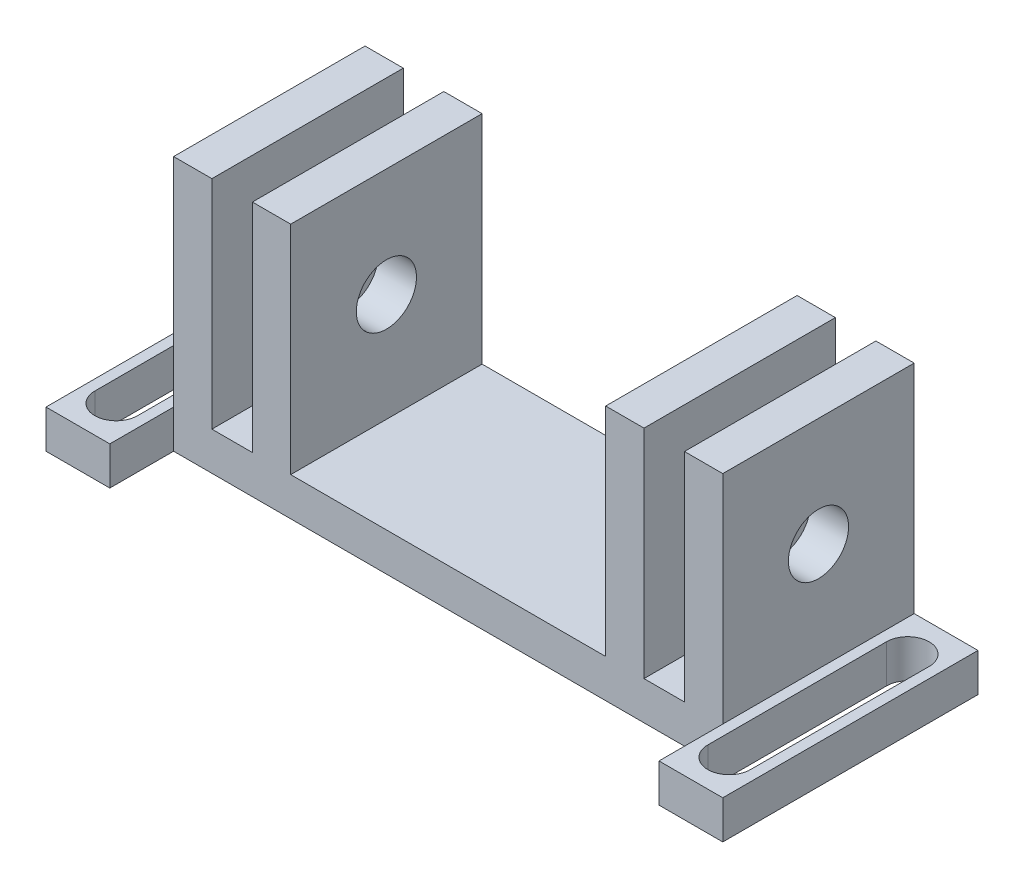
ISO-10303-21;
HEADER;
FILE_DESCRIPTION(('STEP AP214'),'2;1');
FILE_NAME('part.step','',(''),(''),'','','');
FILE_SCHEMA(('AUTOMOTIVE_DESIGN { 1 0 10303 214 1 1 1 1 }'));
ENDSEC;
DATA;
#1=APPLICATION_CONTEXT('core data for automotive mechanical design processes');
#2=APPLICATION_PROTOCOL_DEFINITION('international standard','automotive_design',2000,#1);
#3=PRODUCT_CONTEXT('',#1,'mechanical');
#4=PRODUCT('Part','Part','',(#3));
#5=PRODUCT_RELATED_PRODUCT_CATEGORY('part','',(#4));
#6=PRODUCT_DEFINITION_FORMATION('','',#4);
#7=PRODUCT_DEFINITION_CONTEXT('part definition',#1,'design');
#8=PRODUCT_DEFINITION('design','',#6,#7);
#9=PRODUCT_DEFINITION_SHAPE('','',#8);
#10=(LENGTH_UNIT() NAMED_UNIT(*) SI_UNIT(.MILLI.,.METRE.));
#11=(NAMED_UNIT(*) PLANE_ANGLE_UNIT() SI_UNIT($,.RADIAN.));
#12=(NAMED_UNIT(*) SI_UNIT($,.STERADIAN.) SOLID_ANGLE_UNIT());
#13=UNCERTAINTY_MEASURE_WITH_UNIT(LENGTH_MEASURE(1.E-05),#10,'distance_accuracy_value','');
#14=(GEOMETRIC_REPRESENTATION_CONTEXT(3) GLOBAL_UNCERTAINTY_ASSIGNED_CONTEXT((#13)) GLOBAL_UNIT_ASSIGNED_CONTEXT((#10,
#11,#12)) REPRESENTATION_CONTEXT('',''));
#15=CARTESIAN_POINT('',(0.,0.,0.));
#16=DIRECTION('',(0.,0.,1.));
#17=DIRECTION('',(1.,0.,0.));
#18=AXIS2_PLACEMENT_3D('',#15,#16,#17);
#19=CARTESIAN_POINT('',(21.5173,0.,-28.4315700557794));
#20=DIRECTION('',(1.,0.,0.));
#21=DIRECTION('',(0.,0.,-1.));
#22=AXIS2_PLACEMENT_3D('',#19,#20,#21);
#23=PLANE('',#22);
#24=CARTESIAN_POINT('',(21.5173,11.4772452641454,0.));
#25=DIRECTION('',(-1.,0.,0.));
#26=DIRECTION('',(0.,0.,1.));
#27=AXIS2_PLACEMENT_3D('',#24,#25,#26);
#28=CIRCLE('',#27,2.35818884896752);
#29=CARTESIAN_POINT('',(21.5173,11.4772452641454,2.35818884896752));
#30=VERTEX_POINT('',#29);
#31=EDGE_CURVE('E374',#30,#30,#28,.T.);
#32=ORIENTED_EDGE('',*,*,#31,.T.);
#33=EDGE_LOOP('',(#32));
#34=FACE_BOUND('',#33,.T.);
#35=DIRECTION('',(0.,1.,0.));
#36=VECTOR('',#35,1.);
#37=CARTESIAN_POINT('',(21.5173,0.,7.5));
#38=LINE('',#37,#36);
#39=CARTESIAN_POINT('',(21.5173,3.,7.5));
#40=VERTEX_POINT('',#39);
#41=CARTESIAN_POINT('',(21.5173,20.,7.5));
#42=VERTEX_POINT('',#41);
#43=EDGE_CURVE('E420',#40,#42,#38,.T.);
#44=ORIENTED_EDGE('',*,*,#43,.F.);
#45=DIRECTION('',(0.,0.,-1.));
#46=VECTOR('',#45,1.);
#47=CARTESIAN_POINT('',(21.5173,3.,-7.5));
#48=LINE('',#47,#46);
#49=CARTESIAN_POINT('',(21.5173,3.,-7.5));
#50=VERTEX_POINT('',#49);
#51=EDGE_CURVE('E11',#40,#50,#48,.T.);
#52=ORIENTED_EDGE('',*,*,#51,.T.);
#53=DIRECTION('',(0.,1.,0.));
#54=VECTOR('',#53,1.);
#55=CARTESIAN_POINT('',(21.5173,0.,-7.5));
#56=LINE('',#55,#54);
#57=CARTESIAN_POINT('',(21.5173,20.,-7.5));
#58=VERTEX_POINT('',#57);
#59=EDGE_CURVE('E419',#50,#58,#56,.T.);
#60=ORIENTED_EDGE('',*,*,#59,.T.);
#61=DIRECTION('',(0.,0.,1.));
#62=VECTOR('',#61,1.);
#63=CARTESIAN_POINT('',(21.5173,20.,-28.4315700557794));
#64=LINE('',#63,#62);
#65=EDGE_CURVE('E423',#58,#42,#64,.T.);
#66=ORIENTED_EDGE('',*,*,#65,.T.);
#67=EDGE_LOOP('',(#44,#52,#60,#66));
#68=FACE_BOUND('',#67,.T.);
#69=ADVANCED_FACE('F45',(#34,#68),#23,.T.);
#70=CARTESIAN_POINT('',(15.3423,3.,7.5));
#71=DIRECTION('',(-1.,0.,0.));
#72=DIRECTION('',(0.,0.,1.));
#73=AXIS2_PLACEMENT_3D('',#70,#71,#72);
#74=PLANE('',#73);
#75=CARTESIAN_POINT('',(15.3423,11.4772452641454,0.));
#76=DIRECTION('',(-1.,0.,0.));
#77=DIRECTION('',(0.,0.,1.));
#78=AXIS2_PLACEMENT_3D('',#75,#76,#77);
#79=CIRCLE('',#78,2.35818884896752);
#80=CARTESIAN_POINT('',(15.3423,11.4772452641454,2.35818884896752));
#81=VERTEX_POINT('',#80);
#82=EDGE_CURVE('E394',#81,#81,#79,.T.);
#83=ORIENTED_EDGE('',*,*,#82,.T.);
#84=EDGE_LOOP('',(#83));
#85=FACE_BOUND('',#84,.T.);
#86=DIRECTION('',(0.,0.,1.));
#87=VECTOR('',#86,1.);
#88=CARTESIAN_POINT('',(15.3423,3.,-28.4315700557794));
#89=LINE('',#88,#87);
#90=CARTESIAN_POINT('',(15.3423,3.,-7.5));
#91=VERTEX_POINT('',#90);
#92=CARTESIAN_POINT('',(15.3423,3.,7.5));
#93=VERTEX_POINT('',#92);
#94=EDGE_CURVE('E404',#91,#93,#89,.T.);
#95=ORIENTED_EDGE('',*,*,#94,.F.);
#96=DIRECTION('',(0.,-1.,0.));
#97=VECTOR('',#96,1.);
#98=CARTESIAN_POINT('',(15.3423,3.,-7.5));
#99=LINE('',#98,#97);
#100=CARTESIAN_POINT('',(15.3423,20.,-7.5));
#101=VERTEX_POINT('',#100);
#102=EDGE_CURVE('E547',#101,#91,#99,.T.);
#103=ORIENTED_EDGE('',*,*,#102,.F.);
#104=DIRECTION('',(0.,0.,-1.));
#105=VECTOR('',#104,1.);
#106=CARTESIAN_POINT('',(15.3423,20.,-7.5));
#107=LINE('',#106,#105);
#108=CARTESIAN_POINT('',(15.3423,20.,7.5));
#109=VERTEX_POINT('',#108);
#110=EDGE_CURVE('E500',#109,#101,#107,.T.);
#111=ORIENTED_EDGE('',*,*,#110,.F.);
#112=DIRECTION('',(0.,-1.,0.));
#113=VECTOR('',#112,1.);
#114=CARTESIAN_POINT('',(15.3423,3.,7.5));
#115=LINE('',#114,#113);
#116=EDGE_CURVE('E560',#109,#93,#115,.T.);
#117=ORIENTED_EDGE('',*,*,#116,.T.);
#118=EDGE_LOOP('',(#95,#103,#111,#117));
#119=FACE_BOUND('',#118,.T.);
#120=ADVANCED_FACE('F651',(#85,#119),#74,.F.);
#121=CARTESIAN_POINT('',(-15.3423,3.,7.5));
#122=DIRECTION('',(-1.,0.,0.));
#123=DIRECTION('',(0.,0.,1.));
#124=AXIS2_PLACEMENT_3D('',#121,#122,#123);
#125=PLANE('',#124);
#126=CARTESIAN_POINT('',(-15.3423,11.4772452641454,0.));
#127=DIRECTION('',(-1.,0.,0.));
#128=DIRECTION('',(0.,0.,1.));
#129=AXIS2_PLACEMENT_3D('',#126,#127,#128);
#130=CIRCLE('',#129,2.35818884896752);
#131=CARTESIAN_POINT('',(-15.3423,11.4772452641454,2.35818884896752));
#132=VERTEX_POINT('',#131);
#133=EDGE_CURVE('E390',#132,#132,#130,.T.);
#134=ORIENTED_EDGE('',*,*,#133,.F.);
#135=EDGE_LOOP('',(#134));
#136=FACE_BOUND('',#135,.T.);
#137=DIRECTION('',(0.,-1.,0.));
#138=VECTOR('',#137,1.);
#139=CARTESIAN_POINT('',(-15.3423,3.,-7.5));
#140=LINE('',#139,#138);
#141=CARTESIAN_POINT('',(-15.3423,20.,-7.5));
#142=VERTEX_POINT('',#141);
#143=CARTESIAN_POINT('',(-15.3423,3.,-7.5));
#144=VERTEX_POINT('',#143);
#145=EDGE_CURVE('E55',#142,#144,#140,.T.);
#146=ORIENTED_EDGE('',*,*,#145,.T.);
#147=DIRECTION('',(0.,0.,1.));
#148=VECTOR('',#147,1.);
#149=CARTESIAN_POINT('',(-15.3423,3.,-28.4315700557794));
#150=LINE('',#149,#148);
#151=CARTESIAN_POINT('',(-15.3423,3.,7.5));
#152=VERTEX_POINT('',#151);
#153=EDGE_CURVE('E458',#144,#152,#150,.T.);
#154=ORIENTED_EDGE('',*,*,#153,.T.);
#155=DIRECTION('',(0.,-1.,0.));
#156=VECTOR('',#155,1.);
#157=CARTESIAN_POINT('',(-15.3423,3.,7.5));
#158=LINE('',#157,#156);
#159=CARTESIAN_POINT('',(-15.3423,20.,7.5));
#160=VERTEX_POINT('',#159);
#161=EDGE_CURVE('E556',#160,#152,#158,.T.);
#162=ORIENTED_EDGE('',*,*,#161,.F.);
#163=DIRECTION('',(0.,0.,1.));
#164=VECTOR('',#163,1.);
#165=CARTESIAN_POINT('',(-15.3423,20.,-7.5));
#166=LINE('',#165,#164);
#167=EDGE_CURVE('E513',#142,#160,#166,.T.);
#168=ORIENTED_EDGE('',*,*,#167,.F.);
#169=EDGE_LOOP('',(#146,#154,#162,#168));
#170=FACE_BOUND('',#169,.T.);
#171=ADVANCED_FACE('F657',(#136,#170),#125,.T.);
#172=CARTESIAN_POINT('',(0.,3.,0.));
#173=DIRECTION('',(0.,1.,0.));
#174=DIRECTION('',(0.,0.,1.));
#175=AXIS2_PLACEMENT_3D('',#172,#173,#174);
#176=PLANE('',#175);
#177=DIRECTION('',(1.,0.,0.));
#178=VECTOR('',#177,1.);
#179=CARTESIAN_POINT('',(-15.3423,3.,7.5));
#180=LINE('',#179,#178);
#181=CARTESIAN_POINT('',(-12.3423,3.,7.5));
#182=VERTEX_POINT('',#181);
#183=CARTESIAN_POINT('',(12.3423,3.,7.5));
#184=VERTEX_POINT('',#183);
#185=EDGE_CURVE('E543',#182,#184,#180,.T.);
#186=ORIENTED_EDGE('',*,*,#185,.T.);
#187=DIRECTION('',(0.,0.,1.));
#188=VECTOR('',#187,1.);
#189=CARTESIAN_POINT('',(12.3423,3.,-7.5));
#190=LINE('',#189,#188);
#191=CARTESIAN_POINT('',(12.3423,3.,-7.5));
#192=VERTEX_POINT('',#191);
#193=EDGE_CURVE('E495',#192,#184,#190,.T.);
#194=ORIENTED_EDGE('',*,*,#193,.F.);
#195=DIRECTION('',(1.,0.,0.));
#196=VECTOR('',#195,1.);
#197=CARTESIAN_POINT('',(-15.3423,3.,-7.5));
#198=LINE('',#197,#196);
#199=CARTESIAN_POINT('',(-12.3423,3.,-7.5));
#200=VERTEX_POINT('',#199);
#201=EDGE_CURVE('E539',#200,#192,#198,.T.);
#202=ORIENTED_EDGE('',*,*,#201,.F.);
#203=DIRECTION('',(0.,0.,-1.));
#204=VECTOR('',#203,1.);
#205=CARTESIAN_POINT('',(-12.3423,3.,-7.5));
#206=LINE('',#205,#204);
#207=EDGE_CURVE('E499',#182,#200,#206,.T.);
#208=ORIENTED_EDGE('',*,*,#207,.F.);
#209=EDGE_LOOP('',(#186,#194,#202,#208));
#210=FACE_BOUND('',#209,.T.);
#211=ADVANCED_FACE('F688',(#210),#176,.T.);
#212=CARTESIAN_POINT('',(-15.3423,3.,-7.5));
#213=DIRECTION('',(0.,0.,-1.));
#214=DIRECTION('',(-1.,0.,0.));
#215=AXIS2_PLACEMENT_3D('',#212,#213,#214);
#216=PLANE('',#215);
#217=DIRECTION('',(1.,0.,0.));
#218=VECTOR('',#217,1.);
#219=CARTESIAN_POINT('',(-15.3423,0.,-7.5));
#220=LINE('',#219,#218);
#221=CARTESIAN_POINT('',(-26.5173,0.,-7.5));
#222=VERTEX_POINT('',#221);
#223=CARTESIAN_POINT('',(26.5173,0.,-7.5));
#224=VERTEX_POINT('',#223);
#225=EDGE_CURVE('E538',#222,#224,#220,.T.);
#226=ORIENTED_EDGE('',*,*,#225,.F.);
#227=DIRECTION('',(0.,-1.,0.));
#228=VECTOR('',#227,1.);
#229=CARTESIAN_POINT('',(-26.5173,3.,-7.5));
#230=LINE('',#229,#228);
#231=CARTESIAN_POINT('',(-26.5173,3.,-7.5));
#232=VERTEX_POINT('',#231);
#233=EDGE_CURVE('E360',#232,#222,#230,.T.);
#234=ORIENTED_EDGE('',*,*,#233,.F.);
#235=DIRECTION('',(1.,0.,0.));
#236=VECTOR('',#235,1.);
#237=CARTESIAN_POINT('',(-21.5173,3.,-7.5));
#238=LINE('',#237,#236);
#239=CARTESIAN_POINT('',(-21.5173,3.,-7.5));
#240=VERTEX_POINT('',#239);
#241=EDGE_CURVE('E345',#232,#240,#238,.T.);
#242=ORIENTED_EDGE('',*,*,#241,.T.);
#243=DIRECTION('',(0.,1.,0.));
#244=VECTOR('',#243,1.);
#245=CARTESIAN_POINT('',(-21.5173,0.,-7.5));
#246=LINE('',#245,#244);
#247=CARTESIAN_POINT('',(-21.5173,20.,-7.5));
#248=VERTEX_POINT('',#247);
#249=EDGE_CURVE('E447',#240,#248,#246,.T.);
#250=ORIENTED_EDGE('',*,*,#249,.T.);
#251=DIRECTION('',(-1.,0.,0.));
#252=VECTOR('',#251,1.);
#253=CARTESIAN_POINT('',(0.,20.,-7.5));
#254=LINE('',#253,#252);
#255=CARTESIAN_POINT('',(-18.5173,20.,-7.5));
#256=VERTEX_POINT('',#255);
#257=EDGE_CURVE('E462',#256,#248,#254,.T.);
#258=ORIENTED_EDGE('',*,*,#257,.F.);
#259=DIRECTION('',(0.,-1.,0.));
#260=VECTOR('',#259,1.);
#261=CARTESIAN_POINT('',(-18.5173,0.,-7.5));
#262=LINE('',#261,#260);
#263=CARTESIAN_POINT('',(-18.5173,3.,-7.5));
#264=VERTEX_POINT('',#263);
#265=EDGE_CURVE('E466',#256,#264,#262,.T.);
#266=ORIENTED_EDGE('',*,*,#265,.T.);
#267=DIRECTION('',(-1.,0.,0.));
#268=VECTOR('',#267,1.);
#269=CARTESIAN_POINT('',(0.,3.,-7.5));
#270=LINE('',#269,#268);
#271=EDGE_CURVE('E453',#144,#264,#270,.T.);
#272=ORIENTED_EDGE('',*,*,#271,.F.);
#273=ORIENTED_EDGE('',*,*,#145,.F.);
#274=DIRECTION('',(-1.,0.,0.));
#275=VECTOR('',#274,1.);
#276=CARTESIAN_POINT('',(-15.3423,20.,-7.5));
#277=LINE('',#276,#275);
#278=CARTESIAN_POINT('',(-12.3423,20.,-7.5));
#279=VERTEX_POINT('',#278);
#280=EDGE_CURVE('E523',#279,#142,#277,.T.);
#281=ORIENTED_EDGE('',*,*,#280,.F.);
#282=DIRECTION('',(0.,-1.,0.));
#283=VECTOR('',#282,1.);
#284=CARTESIAN_POINT('',(-12.3423,20.,-7.5));
#285=LINE('',#284,#283);
#286=EDGE_CURVE('E527',#279,#200,#285,.T.);
#287=ORIENTED_EDGE('',*,*,#286,.T.);
#288=ORIENTED_EDGE('',*,*,#201,.T.);
#289=DIRECTION('',(0.,-1.,0.));
#290=VECTOR('',#289,1.);
#291=CARTESIAN_POINT('',(12.3423,20.,-7.5));
#292=LINE('',#291,#290);
#293=CARTESIAN_POINT('',(12.3423,20.,-7.5));
#294=VERTEX_POINT('',#293);
#295=EDGE_CURVE('E470',#294,#192,#292,.T.);
#296=ORIENTED_EDGE('',*,*,#295,.F.);
#297=DIRECTION('',(-1.,0.,0.));
#298=VECTOR('',#297,1.);
#299=CARTESIAN_POINT('',(15.3423,20.,-7.5));
#300=LINE('',#299,#298);
#301=EDGE_CURVE('E507',#101,#294,#300,.T.);
#302=ORIENTED_EDGE('',*,*,#301,.F.);
#303=ORIENTED_EDGE('',*,*,#102,.T.);
#304=DIRECTION('',(1.,0.,0.));
#305=VECTOR('',#304,1.);
#306=CARTESIAN_POINT('',(0.,3.,-7.5));
#307=LINE('',#306,#305);
#308=CARTESIAN_POINT('',(18.5173,3.,-7.5));
#309=VERTEX_POINT('',#308);
#310=EDGE_CURVE('E398',#91,#309,#307,.T.);
#311=ORIENTED_EDGE('',*,*,#310,.T.);
#312=DIRECTION('',(0.,1.,0.));
#313=VECTOR('',#312,1.);
#314=CARTESIAN_POINT('',(18.5173,0.,-7.5));
#315=LINE('',#314,#313);
#316=CARTESIAN_POINT('',(18.5173,20.,-7.5));
#317=VERTEX_POINT('',#316);
#318=EDGE_CURVE('E426',#309,#317,#315,.T.);
#319=ORIENTED_EDGE('',*,*,#318,.T.);
#320=DIRECTION('',(1.,0.,0.));
#321=VECTOR('',#320,1.);
#322=CARTESIAN_POINT('',(0.,20.,-7.5));
#323=LINE('',#322,#321);
#324=EDGE_CURVE('E429',#317,#58,#323,.T.);
#325=ORIENTED_EDGE('',*,*,#324,.T.);
#326=ORIENTED_EDGE('',*,*,#59,.F.);
#327=DIRECTION('',(1.,0.,0.));
#328=VECTOR('',#327,1.);
#329=CARTESIAN_POINT('',(21.5173,3.,-7.5));
#330=LINE('',#329,#328);
#331=CARTESIAN_POINT('',(26.5173,3.,-7.5));
#332=VERTEX_POINT('',#331);
#333=EDGE_CURVE('E64',#50,#332,#330,.T.);
#334=ORIENTED_EDGE('',*,*,#333,.T.);
#335=DIRECTION('',(0.,-1.,0.));
#336=VECTOR('',#335,1.);
#337=CARTESIAN_POINT('',(26.5173,3.,-7.5));
#338=LINE('',#337,#336);
#339=EDGE_CURVE('E747',#332,#224,#338,.T.);
#340=ORIENTED_EDGE('',*,*,#339,.T.);
#341=EDGE_LOOP('',(#226,#234,#242,#250,#258,#266,#272,#273,#281,#287,#288,#296,#302,#303,#311,
#319,#325,#326,#334,#340));
#342=FACE_BOUND('',#341,.T.);
#343=ADVANCED_FACE('F47',(#342),#216,.T.);
#344=CARTESIAN_POINT('',(-15.3423,3.,7.5));
#345=DIRECTION('',(0.,0.,-1.));
#346=DIRECTION('',(-1.,0.,0.));
#347=AXIS2_PLACEMENT_3D('',#344,#345,#346);
#348=PLANE('',#347);
#349=DIRECTION('',(1.,0.,0.));
#350=VECTOR('',#349,1.);
#351=CARTESIAN_POINT('',(-15.3423,0.,7.5));
#352=LINE('',#351,#350);
#353=CARTESIAN_POINT('',(-21.5173,0.,7.5));
#354=VERTEX_POINT('',#353);
#355=CARTESIAN_POINT('',(21.5173,0.,7.5));
#356=VERTEX_POINT('',#355);
#357=EDGE_CURVE('E544',#354,#356,#352,.T.);
#358=ORIENTED_EDGE('',*,*,#357,.T.);
#359=EDGE_CURVE('E415',#356,#40,#38,.T.);
#360=ORIENTED_EDGE('',*,*,#359,.T.);
#361=ORIENTED_EDGE('',*,*,#43,.T.);
#362=DIRECTION('',(1.,0.,0.));
#363=VECTOR('',#362,1.);
#364=CARTESIAN_POINT('',(0.,20.,7.5));
#365=LINE('',#364,#363);
#366=CARTESIAN_POINT('',(18.5173,20.,7.5));
#367=VERTEX_POINT('',#366);
#368=EDGE_CURVE('E410',#367,#42,#365,.T.);
#369=ORIENTED_EDGE('',*,*,#368,.F.);
#370=DIRECTION('',(0.,1.,0.));
#371=VECTOR('',#370,1.);
#372=CARTESIAN_POINT('',(18.5173,0.,7.5));
#373=LINE('',#372,#371);
#374=CARTESIAN_POINT('',(18.5173,3.,7.5));
#375=VERTEX_POINT('',#374);
#376=EDGE_CURVE('E405',#375,#367,#373,.T.);
#377=ORIENTED_EDGE('',*,*,#376,.F.);
#378=DIRECTION('',(1.,0.,0.));
#379=VECTOR('',#378,1.);
#380=CARTESIAN_POINT('',(0.,3.,7.5));
#381=LINE('',#380,#379);
#382=EDGE_CURVE('E399',#93,#375,#381,.T.);
#383=ORIENTED_EDGE('',*,*,#382,.F.);
#384=ORIENTED_EDGE('',*,*,#116,.F.);
#385=DIRECTION('',(1.,0.,0.));
#386=VECTOR('',#385,1.);
#387=CARTESIAN_POINT('',(15.3423,20.,7.5));
#388=LINE('',#387,#386);
#389=CARTESIAN_POINT('',(12.3423,20.,7.5));
#390=VERTEX_POINT('',#389);
#391=EDGE_CURVE('E494',#390,#109,#388,.T.);
#392=ORIENTED_EDGE('',*,*,#391,.F.);
#393=DIRECTION('',(0.,-1.,0.));
#394=VECTOR('',#393,1.);
#395=CARTESIAN_POINT('',(12.3423,20.,7.5));
#396=LINE('',#395,#394);
#397=EDGE_CURVE('E490',#390,#184,#396,.T.);
#398=ORIENTED_EDGE('',*,*,#397,.T.);
#399=ORIENTED_EDGE('',*,*,#185,.F.);
#400=DIRECTION('',(0.,-1.,0.));
#401=VECTOR('',#400,1.);
#402=CARTESIAN_POINT('',(-12.3423,20.,7.5));
#403=LINE('',#402,#401);
#404=CARTESIAN_POINT('',(-12.3423,20.,7.5));
#405=VERTEX_POINT('',#404);
#406=EDGE_CURVE('E534',#405,#182,#403,.T.);
#407=ORIENTED_EDGE('',*,*,#406,.F.);
#408=DIRECTION('',(1.,0.,0.));
#409=VECTOR('',#408,1.);
#410=CARTESIAN_POINT('',(-15.3423,20.,7.5));
#411=LINE('',#410,#409);
#412=EDGE_CURVE('E517',#160,#405,#411,.T.);
#413=ORIENTED_EDGE('',*,*,#412,.F.);
#414=ORIENTED_EDGE('',*,*,#161,.T.);
#415=DIRECTION('',(-1.,0.,0.));
#416=VECTOR('',#415,1.);
#417=CARTESIAN_POINT('',(0.,3.,7.5));
#418=LINE('',#417,#416);
#419=CARTESIAN_POINT('',(-18.5173,3.,7.5));
#420=VERTEX_POINT('',#419);
#421=EDGE_CURVE('E448',#152,#420,#418,.T.);
#422=ORIENTED_EDGE('',*,*,#421,.T.);
#423=DIRECTION('',(0.,-1.,0.));
#424=VECTOR('',#423,1.);
#425=CARTESIAN_POINT('',(-18.5173,0.,7.5));
#426=LINE('',#425,#424);
#427=CARTESIAN_POINT('',(-18.5173,20.,7.5));
#428=VERTEX_POINT('',#427);
#429=EDGE_CURVE('E449',#428,#420,#426,.T.);
#430=ORIENTED_EDGE('',*,*,#429,.F.);
#431=DIRECTION('',(-1.,0.,0.));
#432=VECTOR('',#431,1.);
#433=CARTESIAN_POINT('',(0.,20.,7.5));
#434=LINE('',#433,#432);
#435=CARTESIAN_POINT('',(-21.5173,20.,7.5));
#436=VERTEX_POINT('',#435);
#437=EDGE_CURVE('E443',#428,#436,#434,.T.);
#438=ORIENTED_EDGE('',*,*,#437,.T.);
#439=DIRECTION('',(0.,1.,0.));
#440=VECTOR('',#439,1.);
#441=CARTESIAN_POINT('',(-21.5173,0.,7.5));
#442=LINE('',#441,#440);
#443=CARTESIAN_POINT('',(-21.5173,3.,7.5));
#444=VERTEX_POINT('',#443);
#445=EDGE_CURVE('E403',#444,#436,#442,.T.);
#446=ORIENTED_EDGE('',*,*,#445,.F.);
#447=EDGE_CURVE('E459',#354,#444,#442,.T.);
#448=ORIENTED_EDGE('',*,*,#447,.F.);
#449=EDGE_LOOP('',(#358,#360,#361,#369,#377,#383,#384,#392,#398,#399,#407,#413,#414,#422,#430,
#438,#446,#448));
#450=FACE_BOUND('',#449,.T.);
#451=ADVANCED_FACE('F635',(#450),#348,.F.);
#452=CARTESIAN_POINT('',(0.,0.,0.));
#453=DIRECTION('',(0.,1.,0.));
#454=DIRECTION('',(0.,0.,1.));
#455=AXIS2_PLACEMENT_3D('',#452,#453,#454);
#456=PLANE('',#455);
#457=ORIENTED_EDGE('',*,*,#225,.T.);
#458=DIRECTION('',(0.,0.,1.));
#459=VECTOR('',#458,1.);
#460=CARTESIAN_POINT('',(26.5173,0.,-7.5));
#461=LINE('',#460,#459);
#462=CARTESIAN_POINT('',(26.5173,0.,12.5));
#463=VERTEX_POINT('',#462);
#464=EDGE_CURVE('E601',#224,#463,#461,.T.);
#465=ORIENTED_EDGE('',*,*,#464,.T.);
#466=DIRECTION('',(-1.,0.,0.));
#467=VECTOR('',#466,1.);
#468=CARTESIAN_POINT('',(21.5173,0.,12.5));
#469=LINE('',#468,#467);
#470=CARTESIAN_POINT('',(21.5173,0.,12.5));
#471=VERTEX_POINT('',#470);
#472=EDGE_CURVE('E597',#463,#471,#469,.T.);
#473=ORIENTED_EDGE('',*,*,#472,.T.);
#474=DIRECTION('',(0.,0.,-1.));
#475=VECTOR('',#474,1.);
#476=CARTESIAN_POINT('',(21.5173,0.,-7.5));
#477=LINE('',#476,#475);
#478=EDGE_CURVE('E614',#471,#356,#477,.T.);
#479=ORIENTED_EDGE('',*,*,#478,.T.);
#480=ORIENTED_EDGE('',*,*,#357,.F.);
#481=DIRECTION('',(0.,0.,1.));
#482=VECTOR('',#481,1.);
#483=CARTESIAN_POINT('',(-21.5173,0.,-7.5));
#484=LINE('',#483,#482);
#485=CARTESIAN_POINT('',(-21.5173,0.,12.5));
#486=VERTEX_POINT('',#485);
#487=EDGE_CURVE('E323',#354,#486,#484,.T.);
#488=ORIENTED_EDGE('',*,*,#487,.T.);
#489=DIRECTION('',(-1.,0.,0.));
#490=VECTOR('',#489,1.);
#491=CARTESIAN_POINT('',(-21.5173,0.,12.5));
#492=LINE('',#491,#490);
#493=CARTESIAN_POINT('',(-26.5173,0.,12.5));
#494=VERTEX_POINT('',#493);
#495=EDGE_CURVE('E352',#486,#494,#492,.T.);
#496=ORIENTED_EDGE('',*,*,#495,.T.);
#497=DIRECTION('',(0.,0.,-1.));
#498=VECTOR('',#497,1.);
#499=CARTESIAN_POINT('',(-26.5173,0.,-7.5));
#500=LINE('',#499,#498);
#501=EDGE_CURVE('E356',#494,#222,#500,.T.);
#502=ORIENTED_EDGE('',*,*,#501,.T.);
#503=EDGE_LOOP('',(#457,#465,#473,#479,#480,#488,#496,#502));
#504=FACE_BOUND('',#503,.T.);
#505=CARTESIAN_POINT('',(-24.0173,0.,-4.5));
#506=DIRECTION('',(0.,-1.,0.));
#507=DIRECTION('',(0.,0.,-1.));
#508=AXIS2_PLACEMENT_3D('',#505,#506,#507);
#509=CIRCLE('',#508,1.675);
#510=CARTESIAN_POINT('',(-25.6923,0.,-4.5));
#511=VERTEX_POINT('',#510);
#512=CARTESIAN_POINT('',(-22.3423,0.,-4.5));
#513=VERTEX_POINT('',#512);
#514=EDGE_CURVE('E305',#511,#513,#509,.T.);
#515=ORIENTED_EDGE('',*,*,#514,.F.);
#516=DIRECTION('',(0.,0.,-1.));
#517=VECTOR('',#516,1.);
#518=CARTESIAN_POINT('',(-25.6923,0.,-4.5));
#519=LINE('',#518,#517);
#520=CARTESIAN_POINT('',(-25.6923,0.,9.5));
#521=VERTEX_POINT('',#520);
#522=EDGE_CURVE('E292',#521,#511,#519,.T.);
#523=ORIENTED_EDGE('',*,*,#522,.F.);
#524=CARTESIAN_POINT('',(-24.0173,0.,9.5));
#525=DIRECTION('',(0.,-1.,0.));
#526=DIRECTION('',(0.,0.,-1.));
#527=AXIS2_PLACEMENT_3D('',#524,#525,#526);
#528=CIRCLE('',#527,1.675);
#529=CARTESIAN_POINT('',(-22.3423,0.,9.5));
#530=VERTEX_POINT('',#529);
#531=EDGE_CURVE('E313',#530,#521,#528,.T.);
#532=ORIENTED_EDGE('',*,*,#531,.F.);
#533=DIRECTION('',(0.,0.,1.));
#534=VECTOR('',#533,1.);
#535=CARTESIAN_POINT('',(-22.3423,0.,-4.5));
#536=LINE('',#535,#534);
#537=EDGE_CURVE('E308',#513,#530,#536,.T.);
#538=ORIENTED_EDGE('',*,*,#537,.F.);
#539=EDGE_LOOP('',(#515,#523,#532,#538));
#540=FACE_BOUND('',#539,.T.);
#541=DIRECTION('',(0.,0.,1.));
#542=VECTOR('',#541,1.);
#543=CARTESIAN_POINT('',(25.6923,0.,-4.5));
#544=LINE('',#543,#542);
#545=CARTESIAN_POINT('',(25.6923,0.,-4.5));
#546=VERTEX_POINT('',#545);
#547=CARTESIAN_POINT('',(25.6923,0.,9.5));
#548=VERTEX_POINT('',#547);
#549=EDGE_CURVE('E272',#546,#548,#544,.T.);
#550=ORIENTED_EDGE('',*,*,#549,.F.);
#551=CARTESIAN_POINT('',(24.0173,0.,-4.5));
#552=DIRECTION('',(0.,-1.,0.));
#553=DIRECTION('',(0.,0.,-1.));
#554=AXIS2_PLACEMENT_3D('',#551,#552,#553);
#555=CIRCLE('',#554,1.675);
#556=CARTESIAN_POINT('',(22.3423,0.,-4.5));
#557=VERTEX_POINT('',#556);
#558=EDGE_CURVE('E309',#557,#546,#555,.T.);
#559=ORIENTED_EDGE('',*,*,#558,.F.);
#560=DIRECTION('',(0.,0.,-1.));
#561=VECTOR('',#560,1.);
#562=CARTESIAN_POINT('',(22.3423,0.,-4.5));
#563=LINE('',#562,#561);
#564=CARTESIAN_POINT('',(22.3423,0.,9.5));
#565=VERTEX_POINT('',#564);
#566=EDGE_CURVE('E283',#565,#557,#563,.T.);
#567=ORIENTED_EDGE('',*,*,#566,.F.);
#568=CARTESIAN_POINT('',(24.0173,0.,9.5));
#569=DIRECTION('',(0.,-1.,0.));
#570=DIRECTION('',(0.,0.,-1.));
#571=AXIS2_PLACEMENT_3D('',#568,#569,#570);
#572=CIRCLE('',#571,1.675);
#573=EDGE_CURVE('E618',#548,#565,#572,.T.);
#574=ORIENTED_EDGE('',*,*,#573,.F.);
#575=EDGE_LOOP('',(#550,#559,#567,#574));
#576=FACE_BOUND('',#575,.T.);
#577=ADVANCED_FACE('F632',(#504,#540,#576),#456,.F.);
#578=CARTESIAN_POINT('',(-12.3423,20.,-7.5));
#579=DIRECTION('',(-1.,0.,0.));
#580=DIRECTION('',(0.,0.,1.));
#581=AXIS2_PLACEMENT_3D('',#578,#579,#580);
#582=PLANE('',#581);
#583=CARTESIAN_POINT('',(-12.3423,11.4772452641454,0.));
#584=DIRECTION('',(-1.,0.,0.));
#585=DIRECTION('',(0.,0.,1.));
#586=AXIS2_PLACEMENT_3D('',#583,#584,#585);
#587=CIRCLE('',#586,2.35818884896752);
#588=CARTESIAN_POINT('',(-12.3423,11.4772452641454,2.35818884896752));
#589=VERTEX_POINT('',#588);
#590=EDGE_CURVE('E386',#589,#589,#587,.T.);
#591=ORIENTED_EDGE('',*,*,#590,.T.);
#592=EDGE_LOOP('',(#591));
#593=FACE_BOUND('',#592,.T.);
#594=ORIENTED_EDGE('',*,*,#207,.T.);
#595=ORIENTED_EDGE('',*,*,#286,.F.);
#596=DIRECTION('',(0.,0.,-1.));
#597=VECTOR('',#596,1.);
#598=CARTESIAN_POINT('',(-12.3423,20.,-7.5));
#599=LINE('',#598,#597);
#600=EDGE_CURVE('E520',#405,#279,#599,.T.);
#601=ORIENTED_EDGE('',*,*,#600,.F.);
#602=ORIENTED_EDGE('',*,*,#406,.T.);
#603=EDGE_LOOP('',(#594,#595,#601,#602));
#604=FACE_BOUND('',#603,.T.);
#605=ADVANCED_FACE('F634',(#593,#604),#582,.F.);
#606=CARTESIAN_POINT('',(0.,20.,0.));
#607=DIRECTION('',(0.,1.,0.));
#608=DIRECTION('',(0.,0.,1.));
#609=AXIS2_PLACEMENT_3D('',#606,#607,#608);
#610=PLANE('',#609);
#611=ORIENTED_EDGE('',*,*,#167,.T.);
#612=ORIENTED_EDGE('',*,*,#412,.T.);
#613=ORIENTED_EDGE('',*,*,#600,.T.);
#614=ORIENTED_EDGE('',*,*,#280,.T.);
#615=EDGE_LOOP('',(#611,#612,#613,#614));
#616=FACE_BOUND('',#615,.T.);
#617=ADVANCED_FACE('F642',(#616),#610,.T.);
#618=CARTESIAN_POINT('',(12.3423,20.,-7.5));
#619=DIRECTION('',(1.,0.,0.));
#620=DIRECTION('',(0.,0.,-1.));
#621=AXIS2_PLACEMENT_3D('',#618,#619,#620);
#622=PLANE('',#621);
#623=CARTESIAN_POINT('',(12.3423,11.4772452641454,0.));
#624=DIRECTION('',(1.,0.,0.));
#625=DIRECTION('',(0.,0.,-1.));
#626=AXIS2_PLACEMENT_3D('',#623,#624,#625);
#627=CIRCLE('',#626,2.35818884896752);
#628=CARTESIAN_POINT('',(12.3423,11.4772452641454,-2.35818884896752));
#629=VERTEX_POINT('',#628);
#630=EDGE_CURVE('E382',#629,#629,#627,.T.);
#631=ORIENTED_EDGE('',*,*,#630,.T.);
#632=EDGE_LOOP('',(#631));
#633=FACE_BOUND('',#632,.T.);
#634=ORIENTED_EDGE('',*,*,#193,.T.);
#635=ORIENTED_EDGE('',*,*,#397,.F.);
#636=DIRECTION('',(0.,0.,1.));
#637=VECTOR('',#636,1.);
#638=CARTESIAN_POINT('',(12.3423,20.,-7.5));
#639=LINE('',#638,#637);
#640=EDGE_CURVE('E504',#294,#390,#639,.T.);
#641=ORIENTED_EDGE('',*,*,#640,.F.);
#642=ORIENTED_EDGE('',*,*,#295,.T.);
#643=EDGE_LOOP('',(#634,#635,#641,#642));
#644=FACE_BOUND('',#643,.T.);
#645=ADVANCED_FACE('F679',(#633,#644),#622,.F.);
#646=CARTESIAN_POINT('',(0.,20.,0.));
#647=DIRECTION('',(0.,-1.,0.));
#648=DIRECTION('',(0.,0.,-1.));
#649=AXIS2_PLACEMENT_3D('',#646,#647,#648);
#650=PLANE('',#649);
#651=ORIENTED_EDGE('',*,*,#110,.T.);
#652=ORIENTED_EDGE('',*,*,#301,.T.);
#653=ORIENTED_EDGE('',*,*,#640,.T.);
#654=ORIENTED_EDGE('',*,*,#391,.T.);
#655=EDGE_LOOP('',(#651,#652,#653,#654));
#656=FACE_BOUND('',#655,.T.);
#657=ADVANCED_FACE('F677',(#656),#650,.F.);
#658=CARTESIAN_POINT('',(-21.5173,0.,-28.4315700557794));
#659=DIRECTION('',(1.,0.,0.));
#660=DIRECTION('',(0.,0.,-1.));
#661=AXIS2_PLACEMENT_3D('',#658,#659,#660);
#662=PLANE('',#661);
#663=CARTESIAN_POINT('',(-21.5173,11.4772452641454,0.));
#664=DIRECTION('',(-1.,0.,0.));
#665=DIRECTION('',(0.,0.,1.));
#666=AXIS2_PLACEMENT_3D('',#663,#664,#665);
#667=CIRCLE('',#666,2.35818884896752);
#668=CARTESIAN_POINT('',(-21.5173,11.4772452641454,2.35818884896752));
#669=VERTEX_POINT('',#668);
#670=EDGE_CURVE('E364',#669,#669,#667,.T.);
#671=ORIENTED_EDGE('',*,*,#670,.F.);
#672=EDGE_LOOP('',(#671));
#673=FACE_BOUND('',#672,.T.);
#674=ORIENTED_EDGE('',*,*,#249,.F.);
#675=DIRECTION('',(0.,0.,1.));
#676=VECTOR('',#675,1.);
#677=CARTESIAN_POINT('',(-21.5173,3.,-7.5));
#678=LINE('',#677,#676);
#679=EDGE_CURVE('E333',#240,#444,#678,.T.);
#680=ORIENTED_EDGE('',*,*,#679,.T.);
#681=ORIENTED_EDGE('',*,*,#445,.T.);
#682=DIRECTION('',(0.,0.,1.));
#683=VECTOR('',#682,1.);
#684=CARTESIAN_POINT('',(-21.5173,20.,-28.4315700557794));
#685=LINE('',#684,#683);
#686=EDGE_CURVE('E474',#248,#436,#685,.T.);
#687=ORIENTED_EDGE('',*,*,#686,.F.);
#688=EDGE_LOOP('',(#674,#680,#681,#687));
#689=FACE_BOUND('',#688,.T.);
#690=ADVANCED_FACE('F673',(#673,#689),#662,.F.);
#691=CARTESIAN_POINT('',(0.,20.,-28.4315700557794));
#692=DIRECTION('',(0.,1.,0.));
#693=DIRECTION('',(0.,0.,1.));
#694=AXIS2_PLACEMENT_3D('',#691,#692,#693);
#695=PLANE('',#694);
#696=DIRECTION('',(0.,0.,1.));
#697=VECTOR('',#696,1.);
#698=CARTESIAN_POINT('',(-18.5173,20.,-28.4315700557794));
#699=LINE('',#698,#697);
#700=EDGE_CURVE('E454',#256,#428,#699,.T.);
#701=ORIENTED_EDGE('',*,*,#700,.F.);
#702=ORIENTED_EDGE('',*,*,#257,.T.);
#703=ORIENTED_EDGE('',*,*,#686,.T.);
#704=ORIENTED_EDGE('',*,*,#437,.F.);
#705=EDGE_LOOP('',(#701,#702,#703,#704));
#706=FACE_BOUND('',#705,.T.);
#707=ADVANCED_FACE('F669',(#706),#695,.T.);
#708=CARTESIAN_POINT('',(-18.5173,0.,-28.4315700557794));
#709=DIRECTION('',(-1.,0.,0.));
#710=DIRECTION('',(0.,0.,1.));
#711=AXIS2_PLACEMENT_3D('',#708,#709,#710);
#712=PLANE('',#711);
#713=CARTESIAN_POINT('',(-18.5173,11.4772452641454,0.));
#714=DIRECTION('',(-1.,0.,0.));
#715=DIRECTION('',(0.,0.,1.));
#716=AXIS2_PLACEMENT_3D('',#713,#714,#715);
#717=CIRCLE('',#716,2.35818884896752);
#718=CARTESIAN_POINT('',(-18.5173,11.4772452641454,2.35818884896752));
#719=VERTEX_POINT('',#718);
#720=EDGE_CURVE('E378',#719,#719,#717,.T.);
#721=ORIENTED_EDGE('',*,*,#720,.T.);
#722=EDGE_LOOP('',(#721));
#723=FACE_BOUND('',#722,.T.);
#724=ORIENTED_EDGE('',*,*,#265,.F.);
#725=ORIENTED_EDGE('',*,*,#700,.T.);
#726=ORIENTED_EDGE('',*,*,#429,.T.);
#727=DIRECTION('',(0.,0.,1.));
#728=VECTOR('',#727,1.);
#729=CARTESIAN_POINT('',(-18.5173,3.,-28.4315700557794));
#730=LINE('',#729,#728);
#731=EDGE_CURVE('E465',#264,#420,#730,.T.);
#732=ORIENTED_EDGE('',*,*,#731,.F.);
#733=EDGE_LOOP('',(#724,#725,#726,#732));
#734=FACE_BOUND('',#733,.T.);
#735=ADVANCED_FACE('F665',(#723,#734),#712,.F.);
#736=CARTESIAN_POINT('',(0.,3.,-28.4315700557794));
#737=DIRECTION('',(0.,1.,0.));
#738=DIRECTION('',(-1.,0.,0.));
#739=AXIS2_PLACEMENT_3D('',#736,#737,#738);
#740=PLANE('',#739);
#741=ORIENTED_EDGE('',*,*,#153,.F.);
#742=ORIENTED_EDGE('',*,*,#271,.T.);
#743=ORIENTED_EDGE('',*,*,#731,.T.);
#744=ORIENTED_EDGE('',*,*,#421,.F.);
#745=EDGE_LOOP('',(#741,#742,#743,#744));
#746=FACE_BOUND('',#745,.T.);
#747=ADVANCED_FACE('F662',(#746),#740,.T.);
#748=CARTESIAN_POINT('',(0.,20.,-28.4315700557794));
#749=DIRECTION('',(0.,-1.,0.));
#750=DIRECTION('',(0.,0.,-1.));
#751=AXIS2_PLACEMENT_3D('',#748,#749,#750);
#752=PLANE('',#751);
#753=ORIENTED_EDGE('',*,*,#324,.F.);
#754=DIRECTION('',(0.,0.,1.));
#755=VECTOR('',#754,1.);
#756=CARTESIAN_POINT('',(18.5173,20.,-28.4315700557794));
#757=LINE('',#756,#755);
#758=EDGE_CURVE('E414',#317,#367,#757,.T.);
#759=ORIENTED_EDGE('',*,*,#758,.T.);
#760=ORIENTED_EDGE('',*,*,#368,.T.);
#761=ORIENTED_EDGE('',*,*,#65,.F.);
#762=EDGE_LOOP('',(#753,#759,#760,#761));
#763=FACE_BOUND('',#762,.T.);
#764=ADVANCED_FACE('F583',(#763),#752,.F.);
#765=CARTESIAN_POINT('',(18.5173,0.,-28.4315700557794));
#766=DIRECTION('',(1.,0.,0.));
#767=DIRECTION('',(0.,0.,-1.));
#768=AXIS2_PLACEMENT_3D('',#765,#766,#767);
#769=PLANE('',#768);
#770=CARTESIAN_POINT('',(18.5173,11.4772452641454,0.));
#771=DIRECTION('',(1.,0.,0.));
#772=DIRECTION('',(0.,0.,-1.));
#773=AXIS2_PLACEMENT_3D('',#770,#771,#772);
#774=CIRCLE('',#773,2.35818884896752);
#775=CARTESIAN_POINT('',(18.5173,11.4772452641454,-2.35818884896752));
#776=VERTEX_POINT('',#775);
#777=EDGE_CURVE('E49',#776,#776,#774,.T.);
#778=ORIENTED_EDGE('',*,*,#777,.T.);
#779=EDGE_LOOP('',(#778));
#780=FACE_BOUND('',#779,.T.);
#781=ORIENTED_EDGE('',*,*,#318,.F.);
#782=DIRECTION('',(0.,0.,1.));
#783=VECTOR('',#782,1.);
#784=CARTESIAN_POINT('',(18.5173,3.,-28.4315700557794));
#785=LINE('',#784,#783);
#786=EDGE_CURVE('E409',#309,#375,#785,.T.);
#787=ORIENTED_EDGE('',*,*,#786,.T.);
#788=ORIENTED_EDGE('',*,*,#376,.T.);
#789=ORIENTED_EDGE('',*,*,#758,.F.);
#790=EDGE_LOOP('',(#781,#787,#788,#789));
#791=FACE_BOUND('',#790,.T.);
#792=ADVANCED_FACE('F578',(#780,#791),#769,.F.);
#793=CARTESIAN_POINT('',(0.,3.,-28.4315700557794));
#794=DIRECTION('',(0.,-1.,0.));
#795=DIRECTION('',(0.,0.,-1.));
#796=AXIS2_PLACEMENT_3D('',#793,#794,#795);
#797=PLANE('',#796);
#798=ORIENTED_EDGE('',*,*,#310,.F.);
#799=ORIENTED_EDGE('',*,*,#94,.T.);
#800=ORIENTED_EDGE('',*,*,#382,.T.);
#801=ORIENTED_EDGE('',*,*,#786,.F.);
#802=EDGE_LOOP('',(#798,#799,#800,#801));
#803=FACE_BOUND('',#802,.T.);
#804=ADVANCED_FACE('F572',(#803),#797,.F.);
#805=CARTESIAN_POINT('',(21.5173,11.4772452641454,0.));
#806=DIRECTION('',(-1.,0.,0.));
#807=DIRECTION('',(0.,0.,1.));
#808=AXIS2_PLACEMENT_3D('',#805,#806,#807);
#809=CYLINDRICAL_SURFACE('',#808,2.35818884896752);
#810=ORIENTED_EDGE('',*,*,#31,.F.);
#811=EDGE_LOOP('',(#810));
#812=FACE_BOUND('',#811,.T.);
#813=ORIENTED_EDGE('',*,*,#777,.F.);
#814=EDGE_LOOP('',(#813));
#815=FACE_BOUND('',#814,.T.);
#816=ADVANCED_FACE('F814',(#812,#815),#809,.F.);
#817=ORIENTED_EDGE('',*,*,#670,.T.);
#818=EDGE_LOOP('',(#817));
#819=FACE_BOUND('',#818,.T.);
#820=ORIENTED_EDGE('',*,*,#720,.F.);
#821=EDGE_LOOP('',(#820));
#822=FACE_BOUND('',#821,.T.);
#823=ADVANCED_FACE('F812',(#819,#822),#809,.F.);
#824=ORIENTED_EDGE('',*,*,#630,.F.);
#825=EDGE_LOOP('',(#824));
#826=FACE_BOUND('',#825,.T.);
#827=ORIENTED_EDGE('',*,*,#82,.F.);
#828=EDGE_LOOP('',(#827));
#829=FACE_BOUND('',#828,.T.);
#830=ADVANCED_FACE('F809',(#826,#829),#809,.F.);
#831=ORIENTED_EDGE('',*,*,#133,.T.);
#832=EDGE_LOOP('',(#831));
#833=FACE_BOUND('',#832,.T.);
#834=ORIENTED_EDGE('',*,*,#590,.F.);
#835=EDGE_LOOP('',(#834));
#836=FACE_BOUND('',#835,.T.);
#837=ADVANCED_FACE('F808',(#833,#836),#809,.F.);
#838=CARTESIAN_POINT('',(-21.5173,3.,-7.5));
#839=DIRECTION('',(1.,0.,0.));
#840=DIRECTION('',(0.,0.,-1.));
#841=AXIS2_PLACEMENT_3D('',#838,#839,#840);
#842=PLANE('',#841);
#843=ORIENTED_EDGE('',*,*,#487,.F.);
#844=ORIENTED_EDGE('',*,*,#447,.T.);
#845=CARTESIAN_POINT('',(-21.5173,3.,12.5));
#846=VERTEX_POINT('',#845);
#847=EDGE_CURVE('E71',#444,#846,#678,.T.);
#848=ORIENTED_EDGE('',*,*,#847,.T.);
#849=DIRECTION('',(0.,-1.,0.));
#850=VECTOR('',#849,1.);
#851=CARTESIAN_POINT('',(-21.5173,3.,12.5));
#852=LINE('',#851,#850);
#853=EDGE_CURVE('E349',#846,#486,#852,.T.);
#854=ORIENTED_EDGE('',*,*,#853,.T.);
#855=EDGE_LOOP('',(#843,#844,#848,#854));
#856=FACE_BOUND('',#855,.T.);
#857=ADVANCED_FACE('F727',(#856),#842,.T.);
#858=CARTESIAN_POINT('',(-26.5173,3.,-7.5));
#859=DIRECTION('',(-1.,0.,0.));
#860=DIRECTION('',(0.,0.,1.));
#861=AXIS2_PLACEMENT_3D('',#858,#859,#860);
#862=PLANE('',#861);
#863=ORIENTED_EDGE('',*,*,#501,.F.);
#864=DIRECTION('',(0.,-1.,0.));
#865=VECTOR('',#864,1.);
#866=CARTESIAN_POINT('',(-26.5173,3.,12.5));
#867=LINE('',#866,#865);
#868=CARTESIAN_POINT('',(-26.5173,3.,12.5));
#869=VERTEX_POINT('',#868);
#870=EDGE_CURVE('E365',#869,#494,#867,.T.);
#871=ORIENTED_EDGE('',*,*,#870,.F.);
#872=DIRECTION('',(0.,0.,-1.));
#873=VECTOR('',#872,1.);
#874=CARTESIAN_POINT('',(-26.5173,3.,-7.5));
#875=LINE('',#874,#873);
#876=EDGE_CURVE('E341',#869,#232,#875,.T.);
#877=ORIENTED_EDGE('',*,*,#876,.T.);
#878=ORIENTED_EDGE('',*,*,#233,.T.);
#879=EDGE_LOOP('',(#863,#871,#877,#878));
#880=FACE_BOUND('',#879,.T.);
#881=ADVANCED_FACE('F736',(#880),#862,.T.);
#882=CARTESIAN_POINT('',(-21.5173,3.,12.5));
#883=DIRECTION('',(0.,0.,1.));
#884=DIRECTION('',(1.,0.,0.));
#885=AXIS2_PLACEMENT_3D('',#882,#883,#884);
#886=PLANE('',#885);
#887=ORIENTED_EDGE('',*,*,#495,.F.);
#888=ORIENTED_EDGE('',*,*,#853,.F.);
#889=DIRECTION('',(-1.,0.,0.));
#890=VECTOR('',#889,1.);
#891=CARTESIAN_POINT('',(-21.5173,3.,12.5));
#892=LINE('',#891,#890);
#893=EDGE_CURVE('E337',#846,#869,#892,.T.);
#894=ORIENTED_EDGE('',*,*,#893,.T.);
#895=ORIENTED_EDGE('',*,*,#870,.T.);
#896=EDGE_LOOP('',(#887,#888,#894,#895));
#897=FACE_BOUND('',#896,.T.);
#898=ADVANCED_FACE('F730',(#897),#886,.T.);
#899=CARTESIAN_POINT('',(0.,3.,0.));
#900=DIRECTION('',(0.,-1.,0.));
#901=DIRECTION('',(0.,0.,-1.));
#902=AXIS2_PLACEMENT_3D('',#899,#900,#901);
#903=PLANE('',#902);
#904=DIRECTION('',(0.,0.,-1.));
#905=VECTOR('',#904,1.);
#906=CARTESIAN_POINT('',(-25.6923,3.,-4.5));
#907=LINE('',#906,#905);
#908=CARTESIAN_POINT('',(-25.6923,3.,9.5));
#909=VERTEX_POINT('',#908);
#910=CARTESIAN_POINT('',(-25.6923,3.,-4.5));
#911=VERTEX_POINT('',#910);
#912=EDGE_CURVE('E300',#909,#911,#907,.T.);
#913=ORIENTED_EDGE('',*,*,#912,.T.);
#914=CARTESIAN_POINT('',(-24.0173,3.,-4.5));
#915=DIRECTION('',(0.,-1.,0.));
#916=DIRECTION('',(0.,0.,-1.));
#917=AXIS2_PLACEMENT_3D('',#914,#915,#916);
#918=CIRCLE('',#917,1.675);
#919=CARTESIAN_POINT('',(-22.3423,3.,-4.5));
#920=VERTEX_POINT('',#919);
#921=EDGE_CURVE('E287',#911,#920,#918,.T.);
#922=ORIENTED_EDGE('',*,*,#921,.T.);
#923=DIRECTION('',(0.,0.,1.));
#924=VECTOR('',#923,1.);
#925=CARTESIAN_POINT('',(-22.3423,3.,-4.5));
#926=LINE('',#925,#924);
#927=CARTESIAN_POINT('',(-22.3423,3.,9.5));
#928=VERTEX_POINT('',#927);
#929=EDGE_CURVE('E291',#920,#928,#926,.T.);
#930=ORIENTED_EDGE('',*,*,#929,.T.);
#931=CARTESIAN_POINT('',(-24.0173,3.,9.5));
#932=DIRECTION('',(0.,-1.,0.));
#933=DIRECTION('',(0.,0.,-1.));
#934=AXIS2_PLACEMENT_3D('',#931,#932,#933);
#935=CIRCLE('',#934,1.675);
#936=EDGE_CURVE('E296',#928,#909,#935,.T.);
#937=ORIENTED_EDGE('',*,*,#936,.T.);
#938=EDGE_LOOP('',(#913,#922,#930,#937));
#939=FACE_BOUND('',#938,.T.);
#940=ORIENTED_EDGE('',*,*,#679,.F.);
#941=ORIENTED_EDGE('',*,*,#241,.F.);
#942=ORIENTED_EDGE('',*,*,#876,.F.);
#943=ORIENTED_EDGE('',*,*,#893,.F.);
#944=ORIENTED_EDGE('',*,*,#847,.F.);
#945=EDGE_LOOP('',(#940,#941,#942,#943,#944));
#946=FACE_BOUND('',#945,.T.);
#947=ADVANCED_FACE('F732',(#939,#946),#903,.F.);
#948=CARTESIAN_POINT('',(-24.0173,3.,-4.5));
#949=DIRECTION('',(0.,-1.,0.));
#950=DIRECTION('',(0.,0.,-1.));
#951=AXIS2_PLACEMENT_3D('',#948,#949,#950);
#952=CYLINDRICAL_SURFACE('',#951,1.675);
#953=ORIENTED_EDGE('',*,*,#514,.T.);
#954=DIRECTION('',(0.,-1.,0.));
#955=VECTOR('',#954,1.);
#956=CARTESIAN_POINT('',(-22.3423,3.,-4.5));
#957=LINE('',#956,#955);
#958=EDGE_CURVE('E304',#920,#513,#957,.T.);
#959=ORIENTED_EDGE('',*,*,#958,.F.);
#960=ORIENTED_EDGE('',*,*,#921,.F.);
#961=DIRECTION('',(0.,-1.,0.));
#962=VECTOR('',#961,1.);
#963=CARTESIAN_POINT('',(-25.6923,3.,-4.5));
#964=LINE('',#963,#962);
#965=EDGE_CURVE('E320',#911,#511,#964,.T.);
#966=ORIENTED_EDGE('',*,*,#965,.T.);
#967=EDGE_LOOP('',(#953,#959,#960,#966));
#968=FACE_BOUND('',#967,.T.);
#969=ADVANCED_FACE('F788',(#968),#952,.F.);
#970=CARTESIAN_POINT('',(-25.6923,3.,-4.5));
#971=DIRECTION('',(-1.,0.,0.));
#972=DIRECTION('',(0.,0.,1.));
#973=AXIS2_PLACEMENT_3D('',#970,#971,#972);
#974=PLANE('',#973);
#975=ORIENTED_EDGE('',*,*,#522,.T.);
#976=ORIENTED_EDGE('',*,*,#965,.F.);
#977=ORIENTED_EDGE('',*,*,#912,.F.);
#978=DIRECTION('',(0.,-1.,0.));
#979=VECTOR('',#978,1.);
#980=CARTESIAN_POINT('',(-25.6923,3.,9.5));
#981=LINE('',#980,#979);
#982=EDGE_CURVE('E324',#909,#521,#981,.T.);
#983=ORIENTED_EDGE('',*,*,#982,.T.);
#984=EDGE_LOOP('',(#975,#976,#977,#983));
#985=FACE_BOUND('',#984,.T.);
#986=ADVANCED_FACE('F784',(#985),#974,.F.);
#987=CARTESIAN_POINT('',(-24.0173,3.,9.5));
#988=DIRECTION('',(0.,-1.,0.));
#989=DIRECTION('',(0.,0.,-1.));
#990=AXIS2_PLACEMENT_3D('',#987,#988,#989);
#991=CYLINDRICAL_SURFACE('',#990,1.675);
#992=ORIENTED_EDGE('',*,*,#531,.T.);
#993=ORIENTED_EDGE('',*,*,#982,.F.);
#994=ORIENTED_EDGE('',*,*,#936,.F.);
#995=DIRECTION('',(0.,-1.,0.));
#996=VECTOR('',#995,1.);
#997=CARTESIAN_POINT('',(-22.3423,3.,9.5));
#998=LINE('',#997,#996);
#999=EDGE_CURVE('E327',#928,#530,#998,.T.);
#1000=ORIENTED_EDGE('',*,*,#999,.T.);
#1001=EDGE_LOOP('',(#992,#993,#994,#1000));
#1002=FACE_BOUND('',#1001,.T.);
#1003=ADVANCED_FACE('F787',(#1002),#991,.F.);
#1004=CARTESIAN_POINT('',(-22.3423,3.,-4.5));
#1005=DIRECTION('',(1.,0.,0.));
#1006=DIRECTION('',(0.,0.,-1.));
#1007=AXIS2_PLACEMENT_3D('',#1004,#1005,#1006);
#1008=PLANE('',#1007);
#1009=ORIENTED_EDGE('',*,*,#537,.T.);
#1010=ORIENTED_EDGE('',*,*,#999,.F.);
#1011=ORIENTED_EDGE('',*,*,#929,.F.);
#1012=ORIENTED_EDGE('',*,*,#958,.T.);
#1013=EDGE_LOOP('',(#1009,#1010,#1011,#1012));
#1014=FACE_BOUND('',#1013,.T.);
#1015=ADVANCED_FACE('F771',(#1014),#1008,.F.);
#1016=CARTESIAN_POINT('',(21.5173,3.,-7.5));
#1017=DIRECTION('',(-1.,0.,0.));
#1018=DIRECTION('',(0.,0.,1.));
#1019=AXIS2_PLACEMENT_3D('',#1016,#1017,#1018);
#1020=PLANE('',#1019);
#1021=ORIENTED_EDGE('',*,*,#359,.F.);
#1022=ORIENTED_EDGE('',*,*,#478,.F.);
#1023=DIRECTION('',(0.,-1.,0.));
#1024=VECTOR('',#1023,1.);
#1025=CARTESIAN_POINT('',(21.5173,3.,12.5));
#1026=LINE('',#1025,#1024);
#1027=CARTESIAN_POINT('',(21.5173,3.,12.5));
#1028=VERTEX_POINT('',#1027);
#1029=EDGE_CURVE('E595',#1028,#471,#1026,.T.);
#1030=ORIENTED_EDGE('',*,*,#1029,.F.);
#1031=EDGE_CURVE('E57',#1028,#40,#48,.T.);
#1032=ORIENTED_EDGE('',*,*,#1031,.T.);
#1033=EDGE_LOOP('',(#1021,#1022,#1030,#1032));
#1034=FACE_BOUND('',#1033,.T.);
#1035=ADVANCED_FACE('F592',(#1034),#1020,.T.);
#1036=CARTESIAN_POINT('',(21.5173,3.,12.5));
#1037=DIRECTION('',(0.,0.,1.));
#1038=DIRECTION('',(1.,0.,0.));
#1039=AXIS2_PLACEMENT_3D('',#1036,#1037,#1038);
#1040=PLANE('',#1039);
#1041=ORIENTED_EDGE('',*,*,#472,.F.);
#1042=DIRECTION('',(0.,-1.,0.));
#1043=VECTOR('',#1042,1.);
#1044=CARTESIAN_POINT('',(26.5173,3.,12.5));
#1045=LINE('',#1044,#1043);
#1046=CARTESIAN_POINT('',(26.5173,3.,12.5));
#1047=VERTEX_POINT('',#1046);
#1048=EDGE_CURVE('E753',#1047,#463,#1045,.T.);
#1049=ORIENTED_EDGE('',*,*,#1048,.F.);
#1050=DIRECTION('',(-1.,0.,0.));
#1051=VECTOR('',#1050,1.);
#1052=CARTESIAN_POINT('',(21.5173,3.,12.5));
#1053=LINE('',#1052,#1051);
#1054=EDGE_CURVE('E745',#1047,#1028,#1053,.T.);
#1055=ORIENTED_EDGE('',*,*,#1054,.T.);
#1056=ORIENTED_EDGE('',*,*,#1029,.T.);
#1057=EDGE_LOOP('',(#1041,#1049,#1055,#1056));
#1058=FACE_BOUND('',#1057,.T.);
#1059=ADVANCED_FACE('F756',(#1058),#1040,.T.);
#1060=CARTESIAN_POINT('',(26.5173,3.,-7.5));
#1061=DIRECTION('',(1.,0.,0.));
#1062=DIRECTION('',(0.,0.,-1.));
#1063=AXIS2_PLACEMENT_3D('',#1060,#1061,#1062);
#1064=PLANE('',#1063);
#1065=ORIENTED_EDGE('',*,*,#464,.F.);
#1066=ORIENTED_EDGE('',*,*,#339,.F.);
#1067=DIRECTION('',(0.,0.,1.));
#1068=VECTOR('',#1067,1.);
#1069=CARTESIAN_POINT('',(26.5173,3.,-7.5));
#1070=LINE('',#1069,#1068);
#1071=EDGE_CURVE('E603',#332,#1047,#1070,.T.);
#1072=ORIENTED_EDGE('',*,*,#1071,.T.);
#1073=ORIENTED_EDGE('',*,*,#1048,.T.);
#1074=EDGE_LOOP('',(#1065,#1066,#1072,#1073));
#1075=FACE_BOUND('',#1074,.T.);
#1076=ADVANCED_FACE('F752',(#1075),#1064,.T.);
#1077=CARTESIAN_POINT('',(0.,3.,0.));
#1078=DIRECTION('',(0.,1.,0.));
#1079=DIRECTION('',(0.,0.,1.));
#1080=AXIS2_PLACEMENT_3D('',#1077,#1078,#1079);
#1081=PLANE('',#1080);
#1082=CARTESIAN_POINT('',(24.0173,3.,-4.5));
#1083=DIRECTION('',(0.,-1.,0.));
#1084=DIRECTION('',(0.,0.,-1.));
#1085=AXIS2_PLACEMENT_3D('',#1082,#1083,#1084);
#1086=CIRCLE('',#1085,1.675);
#1087=CARTESIAN_POINT('',(22.3423,3.,-4.5));
#1088=VERTEX_POINT('',#1087);
#1089=CARTESIAN_POINT('',(25.6923,3.,-4.5));
#1090=VERTEX_POINT('',#1089);
#1091=EDGE_CURVE('E279',#1088,#1090,#1086,.T.);
#1092=ORIENTED_EDGE('',*,*,#1091,.T.);
#1093=DIRECTION('',(0.,0.,1.));
#1094=VECTOR('',#1093,1.);
#1095=CARTESIAN_POINT('',(25.6923,3.,-4.5));
#1096=LINE('',#1095,#1094);
#1097=CARTESIAN_POINT('',(25.6923,3.,9.5));
#1098=VERTEX_POINT('',#1097);
#1099=EDGE_CURVE('E263',#1090,#1098,#1096,.T.);
#1100=ORIENTED_EDGE('',*,*,#1099,.T.);
#1101=CARTESIAN_POINT('',(24.0173,3.,9.5));
#1102=DIRECTION('',(0.,-1.,0.));
#1103=DIRECTION('',(0.,0.,-1.));
#1104=AXIS2_PLACEMENT_3D('',#1101,#1102,#1103);
#1105=CIRCLE('',#1104,1.675);
#1106=CARTESIAN_POINT('',(22.3423,3.,9.5));
#1107=VERTEX_POINT('',#1106);
#1108=EDGE_CURVE('E251',#1098,#1107,#1105,.T.);
#1109=ORIENTED_EDGE('',*,*,#1108,.T.);
#1110=DIRECTION('',(0.,0.,-1.));
#1111=VECTOR('',#1110,1.);
#1112=CARTESIAN_POINT('',(22.3423,3.,-4.5));
#1113=LINE('',#1112,#1111);
#1114=EDGE_CURVE('E264',#1107,#1088,#1113,.T.);
#1115=ORIENTED_EDGE('',*,*,#1114,.T.);
#1116=EDGE_LOOP('',(#1092,#1100,#1109,#1115));
#1117=FACE_BOUND('',#1116,.T.);
#1118=ORIENTED_EDGE('',*,*,#1031,.F.);
#1119=ORIENTED_EDGE('',*,*,#1054,.F.);
#1120=ORIENTED_EDGE('',*,*,#1071,.F.);
#1121=ORIENTED_EDGE('',*,*,#333,.F.);
#1122=ORIENTED_EDGE('',*,*,#51,.F.);
#1123=EDGE_LOOP('',(#1118,#1119,#1120,#1121,#1122));
#1124=FACE_BOUND('',#1123,.T.);
#1125=ADVANCED_FACE('F277',(#1117,#1124),#1081,.T.);
#1126=CARTESIAN_POINT('',(24.0173,3.,-4.5));
#1127=DIRECTION('',(0.,-1.,0.));
#1128=DIRECTION('',(0.,0.,-1.));
#1129=AXIS2_PLACEMENT_3D('',#1126,#1127,#1128);
#1130=CYLINDRICAL_SURFACE('',#1129,1.675);
#1131=ORIENTED_EDGE('',*,*,#558,.T.);
#1132=DIRECTION('',(0.,-1.,0.));
#1133=VECTOR('',#1132,1.);
#1134=CARTESIAN_POINT('',(25.6923,3.,-4.5));
#1135=LINE('',#1134,#1133);
#1136=EDGE_CURVE('E275',#1090,#546,#1135,.T.);
#1137=ORIENTED_EDGE('',*,*,#1136,.F.);
#1138=ORIENTED_EDGE('',*,*,#1091,.F.);
#1139=DIRECTION('',(0.,-1.,0.));
#1140=VECTOR('',#1139,1.);
#1141=CARTESIAN_POINT('',(22.3423,3.,-4.5));
#1142=LINE('',#1141,#1140);
#1143=EDGE_CURVE('E611',#1088,#557,#1142,.T.);
#1144=ORIENTED_EDGE('',*,*,#1143,.T.);
#1145=EDGE_LOOP('',(#1131,#1137,#1138,#1144));
#1146=FACE_BOUND('',#1145,.T.);
#1147=ADVANCED_FACE('F630',(#1146),#1130,.F.);
#1148=CARTESIAN_POINT('',(22.3423,3.,-4.5));
#1149=DIRECTION('',(-1.,0.,0.));
#1150=DIRECTION('',(0.,0.,1.));
#1151=AXIS2_PLACEMENT_3D('',#1148,#1149,#1150);
#1152=PLANE('',#1151);
#1153=ORIENTED_EDGE('',*,*,#566,.T.);
#1154=ORIENTED_EDGE('',*,*,#1143,.F.);
#1155=ORIENTED_EDGE('',*,*,#1114,.F.);
#1156=DIRECTION('',(0.,-1.,0.));
#1157=VECTOR('',#1156,1.);
#1158=CARTESIAN_POINT('',(22.3423,3.,9.5));
#1159=LINE('',#1158,#1157);
#1160=EDGE_CURVE('E257',#1107,#565,#1159,.T.);
#1161=ORIENTED_EDGE('',*,*,#1160,.T.);
#1162=EDGE_LOOP('',(#1153,#1154,#1155,#1161));
#1163=FACE_BOUND('',#1162,.T.);
#1164=ADVANCED_FACE('F626',(#1163),#1152,.F.);
#1165=CARTESIAN_POINT('',(24.0173,3.,9.5));
#1166=DIRECTION('',(0.,-1.,0.));
#1167=DIRECTION('',(0.,0.,-1.));
#1168=AXIS2_PLACEMENT_3D('',#1165,#1166,#1167);
#1169=CYLINDRICAL_SURFACE('',#1168,1.675);
#1170=ORIENTED_EDGE('',*,*,#573,.T.);
#1171=ORIENTED_EDGE('',*,*,#1160,.F.);
#1172=ORIENTED_EDGE('',*,*,#1108,.F.);
#1173=DIRECTION('',(0.,-1.,0.));
#1174=VECTOR('',#1173,1.);
#1175=CARTESIAN_POINT('',(25.6923,3.,9.5));
#1176=LINE('',#1175,#1174);
#1177=EDGE_CURVE('E255',#1098,#548,#1176,.T.);
#1178=ORIENTED_EDGE('',*,*,#1177,.T.);
#1179=EDGE_LOOP('',(#1170,#1171,#1172,#1178));
#1180=FACE_BOUND('',#1179,.T.);
#1181=ADVANCED_FACE('F254',(#1180),#1169,.F.);
#1182=CARTESIAN_POINT('',(25.6923,3.,-4.5));
#1183=DIRECTION('',(1.,0.,0.));
#1184=DIRECTION('',(0.,0.,-1.));
#1185=AXIS2_PLACEMENT_3D('',#1182,#1183,#1184);
#1186=PLANE('',#1185);
#1187=ORIENTED_EDGE('',*,*,#549,.T.);
#1188=ORIENTED_EDGE('',*,*,#1177,.F.);
#1189=ORIENTED_EDGE('',*,*,#1099,.F.);
#1190=ORIENTED_EDGE('',*,*,#1136,.T.);
#1191=EDGE_LOOP('',(#1187,#1188,#1189,#1190));
#1192=FACE_BOUND('',#1191,.T.);
#1193=ADVANCED_FACE('F268',(#1192),#1186,.F.);
#1194=CLOSED_SHELL('',(#69,#120,#171,#211,#343,#451,#577,#605,#617,#645,#657,#690,#707,#735,
#747,#764,#792,#804,#816,#823,#830,#837,#857,#881,#898,#947,#969,#986,#1003,#1015,#1035,#1059,
#1076,#1125,#1147,#1164,#1181,#1193));
#1195=MANIFOLD_SOLID_BREP('B2',#1194);
#1196=ADVANCED_BREP_SHAPE_REPRESENTATION('',(#18,#1195),#14);
#1197=SHAPE_DEFINITION_REPRESENTATION(#9,#1196);
ENDSEC;
END-ISO-10303-21;
